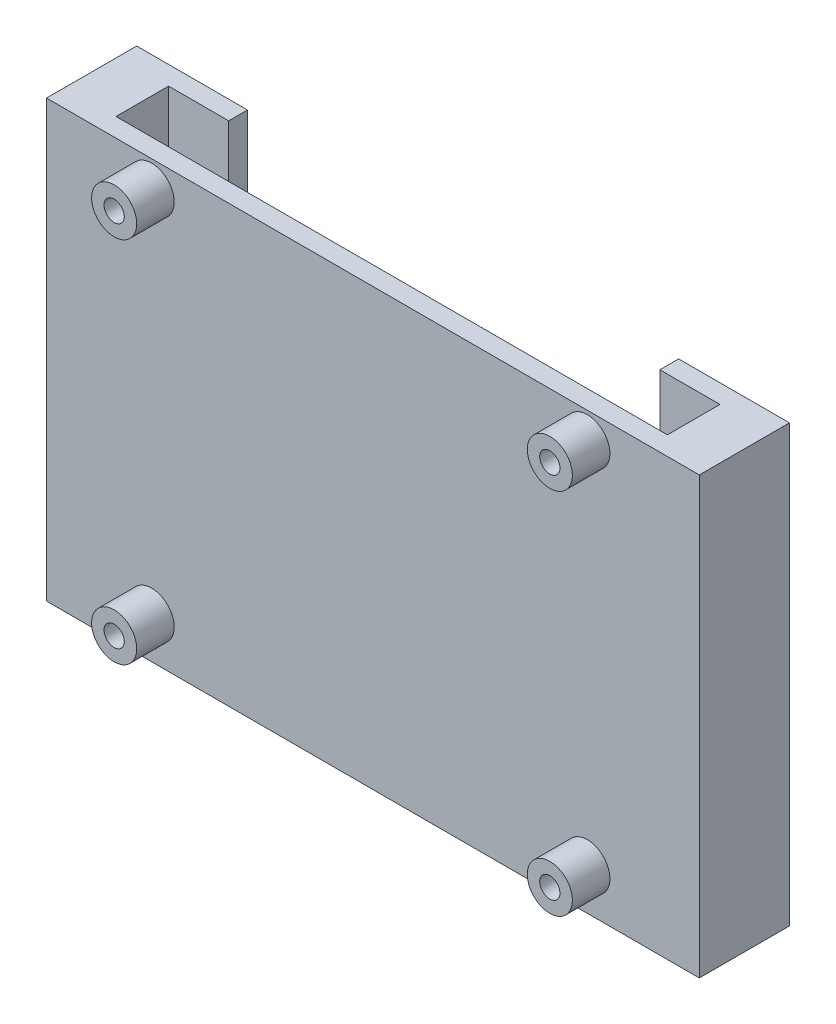
ISO-10303-21;
HEADER;
FILE_DESCRIPTION(('STEP AP214'),'2;1');
FILE_NAME('part.step','',(''),(''),'','','');
FILE_SCHEMA(('AUTOMOTIVE_DESIGN { 1 0 10303 214 1 1 1 1 }'));
ENDSEC;
DATA;
#1=APPLICATION_CONTEXT('core data for automotive mechanical design processes');
#2=APPLICATION_PROTOCOL_DEFINITION('international standard','automotive_design',2000,#1);
#3=PRODUCT_CONTEXT('',#1,'mechanical');
#4=PRODUCT('Part','Part','',(#3));
#5=PRODUCT_RELATED_PRODUCT_CATEGORY('part','',(#4));
#6=PRODUCT_DEFINITION_FORMATION('','',#4);
#7=PRODUCT_DEFINITION_CONTEXT('part definition',#1,'design');
#8=PRODUCT_DEFINITION('design','',#6,#7);
#9=PRODUCT_DEFINITION_SHAPE('','',#8);
#10=(LENGTH_UNIT() NAMED_UNIT(*) SI_UNIT(.MILLI.,.METRE.));
#11=(NAMED_UNIT(*) PLANE_ANGLE_UNIT() SI_UNIT($,.RADIAN.));
#12=(NAMED_UNIT(*) SI_UNIT($,.STERADIAN.) SOLID_ANGLE_UNIT());
#13=UNCERTAINTY_MEASURE_WITH_UNIT(LENGTH_MEASURE(1.E-05),#10,'distance_accuracy_value','');
#14=(GEOMETRIC_REPRESENTATION_CONTEXT(3) GLOBAL_UNCERTAINTY_ASSIGNED_CONTEXT((#13)) GLOBAL_UNIT_ASSIGNED_CONTEXT((#10,
#11,#12)) REPRESENTATION_CONTEXT('',''));
#15=CARTESIAN_POINT('',(0.,0.,0.));
#16=DIRECTION('',(0.,0.,1.));
#17=DIRECTION('',(1.,0.,0.));
#18=AXIS2_PLACEMENT_3D('',#15,#16,#17);
#19=CARTESIAN_POINT('',(-36.7,29.,-9.5));
#20=DIRECTION('',(-1.,0.,0.));
#21=DIRECTION('',(0.,0.,1.));
#22=AXIS2_PLACEMENT_3D('',#19,#20,#21);
#23=PLANE('',#22);
#24=DIRECTION('',(0.,-1.,0.));
#25=VECTOR('',#24,1.);
#26=CARTESIAN_POINT('',(-36.7,29.,-6.99999999999999));
#27=LINE('',#26,#25);
#28=CARTESIAN_POINT('',(-36.7,29.,-6.99999999999999));
#29=VERTEX_POINT('',#28);
#30=CARTESIAN_POINT('',(-36.7,-29.,-6.99999999999999));
#31=VERTEX_POINT('',#30);
#32=EDGE_CURVE('E157',#29,#31,#27,.T.);
#33=ORIENTED_EDGE('',*,*,#32,.F.);
#34=DIRECTION('',(0.,0.,1.));
#35=VECTOR('',#34,1.);
#36=CARTESIAN_POINT('',(-36.7,29.,-9.5));
#37=LINE('',#36,#35);
#38=CARTESIAN_POINT('',(-36.7,29.,0.));
#39=VERTEX_POINT('',#38);
#40=EDGE_CURVE('E186',#29,#39,#37,.T.);
#41=ORIENTED_EDGE('',*,*,#40,.T.);
#42=DIRECTION('',(0.,-1.,0.));
#43=VECTOR('',#42,1.);
#44=CARTESIAN_POINT('',(-36.7,29.,0.));
#45=LINE('',#44,#43);
#46=CARTESIAN_POINT('',(-36.7,-29.,0.));
#47=VERTEX_POINT('',#46);
#48=EDGE_CURVE('E191',#39,#47,#45,.T.);
#49=ORIENTED_EDGE('',*,*,#48,.T.);
#50=DIRECTION('',(0.,0.,1.));
#51=VECTOR('',#50,1.);
#52=CARTESIAN_POINT('',(-36.7,-29.,-9.5));
#53=LINE('',#52,#51);
#54=EDGE_CURVE('E57',#31,#47,#53,.T.);
#55=ORIENTED_EDGE('',*,*,#54,.F.);
#56=EDGE_LOOP('',(#33,#41,#49,#55));
#57=FACE_BOUND('',#56,.T.);
#58=ADVANCED_FACE('F41',(#57),#23,.F.);
#59=CARTESIAN_POINT('',(36.7,29.,-9.5));
#60=DIRECTION('',(1.,0.,0.));
#61=DIRECTION('',(0.,1.,0.));
#62=AXIS2_PLACEMENT_3D('',#59,#60,#61);
#63=PLANE('',#62);
#64=DIRECTION('',(0.,1.,0.));
#65=VECTOR('',#64,1.);
#66=CARTESIAN_POINT('',(36.7,29.,-7.));
#67=LINE('',#66,#65);
#68=CARTESIAN_POINT('',(36.7,-29.,-6.99999999999999));
#69=VERTEX_POINT('',#68);
#70=CARTESIAN_POINT('',(36.7,29.,-7.));
#71=VERTEX_POINT('',#70);
#72=EDGE_CURVE('E175',#69,#71,#67,.T.);
#73=ORIENTED_EDGE('',*,*,#72,.F.);
#74=DIRECTION('',(0.,0.,1.));
#75=VECTOR('',#74,1.);
#76=CARTESIAN_POINT('',(36.7,-29.,-9.5));
#77=LINE('',#76,#75);
#78=CARTESIAN_POINT('',(36.7,-29.,0.));
#79=VERTEX_POINT('',#78);
#80=EDGE_CURVE('E63',#69,#79,#77,.T.);
#81=ORIENTED_EDGE('',*,*,#80,.T.);
#82=DIRECTION('',(0.,1.,0.));
#83=VECTOR('',#82,1.);
#84=CARTESIAN_POINT('',(36.7,29.,0.));
#85=LINE('',#84,#83);
#86=CARTESIAN_POINT('',(36.7,29.,0.));
#87=VERTEX_POINT('',#86);
#88=EDGE_CURVE('E193',#79,#87,#85,.T.);
#89=ORIENTED_EDGE('',*,*,#88,.T.);
#90=DIRECTION('',(0.,0.,1.));
#91=VECTOR('',#90,1.);
#92=CARTESIAN_POINT('',(36.7,29.,-9.5));
#93=LINE('',#92,#91);
#94=EDGE_CURVE('E204',#71,#87,#93,.T.);
#95=ORIENTED_EDGE('',*,*,#94,.F.);
#96=EDGE_LOOP('',(#73,#81,#89,#95));
#97=FACE_BOUND('',#96,.T.);
#98=ADVANCED_FACE('F308',(#97),#63,.F.);
#99=CARTESIAN_POINT('',(0.,0.,0.));
#100=DIRECTION('',(0.,0.,-1.));
#101=DIRECTION('',(-1.,0.,0.));
#102=AXIS2_PLACEMENT_3D('',#99,#100,#101);
#103=PLANE('',#102);
#104=CARTESIAN_POINT('',(-29.45,25.5,0.));
#105=DIRECTION('',(0.,0.,1.));
#106=DIRECTION('',(1.,0.,0.));
#107=AXIS2_PLACEMENT_3D('',#104,#105,#106);
#108=CIRCLE('',#107,1.35);
#109=CARTESIAN_POINT('',(-28.1,25.5,0.));
#110=VERTEX_POINT('',#109);
#111=EDGE_CURVE('E211',#110,#110,#108,.T.);
#112=ORIENTED_EDGE('',*,*,#111,.T.);
#113=EDGE_LOOP('',(#112));
#114=FACE_BOUND('',#113,.T.);
#115=CARTESIAN_POINT('',(-29.45,-23.5,0.));
#116=DIRECTION('',(0.,0.,1.));
#117=DIRECTION('',(1.,0.,0.));
#118=AXIS2_PLACEMENT_3D('',#115,#116,#117);
#119=CIRCLE('',#118,1.35);
#120=CARTESIAN_POINT('',(-28.1,-23.5,0.));
#121=VERTEX_POINT('',#120);
#122=EDGE_CURVE('E220',#121,#121,#119,.T.);
#123=ORIENTED_EDGE('',*,*,#122,.T.);
#124=EDGE_LOOP('',(#123));
#125=FACE_BOUND('',#124,.T.);
#126=CARTESIAN_POINT('',(28.55,25.5,0.));
#127=DIRECTION('',(0.,0.,1.));
#128=DIRECTION('',(1.,0.,0.));
#129=AXIS2_PLACEMENT_3D('',#126,#127,#128);
#130=CIRCLE('',#129,1.35);
#131=CARTESIAN_POINT('',(29.9,25.5,0.));
#132=VERTEX_POINT('',#131);
#133=EDGE_CURVE('E222',#132,#132,#130,.T.);
#134=ORIENTED_EDGE('',*,*,#133,.T.);
#135=EDGE_LOOP('',(#134));
#136=FACE_BOUND('',#135,.T.);
#137=CARTESIAN_POINT('',(28.55,-23.5,0.));
#138=DIRECTION('',(0.,0.,1.));
#139=DIRECTION('',(1.,0.,0.));
#140=AXIS2_PLACEMENT_3D('',#137,#138,#139);
#141=CIRCLE('',#140,1.35);
#142=CARTESIAN_POINT('',(29.9,-23.5,0.));
#143=VERTEX_POINT('',#142);
#144=EDGE_CURVE('E229',#143,#143,#141,.T.);
#145=ORIENTED_EDGE('',*,*,#144,.T.);
#146=EDGE_LOOP('',(#145));
#147=FACE_BOUND('',#146,.T.);
#148=DIRECTION('',(1.,0.,0.));
#149=VECTOR('',#148,1.);
#150=CARTESIAN_POINT('',(-43.45,-29.,0.));
#151=LINE('',#150,#149);
#152=EDGE_CURVE('E249',#47,#79,#151,.T.);
#153=ORIENTED_EDGE('',*,*,#152,.F.);
#154=ORIENTED_EDGE('',*,*,#48,.F.);
#155=DIRECTION('',(-1.,0.,0.));
#156=VECTOR('',#155,1.);
#157=CARTESIAN_POINT('',(-43.45,29.,0.));
#158=LINE('',#157,#156);
#159=EDGE_CURVE('E244',#87,#39,#158,.T.);
#160=ORIENTED_EDGE('',*,*,#159,.F.);
#161=ORIENTED_EDGE('',*,*,#88,.F.);
#162=EDGE_LOOP('',(#153,#154,#160,#161));
#163=FACE_BOUND('',#162,.T.);
#164=ADVANCED_FACE('F315',(#114,#125,#136,#147,#163),#103,.T.);
#165=CARTESIAN_POINT('',(43.45,-29.,2.5));
#166=DIRECTION('',(-1.,0.,0.));
#167=DIRECTION('',(0.,0.,1.));
#168=AXIS2_PLACEMENT_3D('',#165,#166,#167);
#169=PLANE('',#168);
#170=DIRECTION('',(0.,0.,-1.));
#171=VECTOR('',#170,1.);
#172=CARTESIAN_POINT('',(43.45,-29.,2.5));
#173=LINE('',#172,#171);
#174=CARTESIAN_POINT('',(43.45,-29.,2.5));
#175=VERTEX_POINT('',#174);
#176=CARTESIAN_POINT('',(43.45,-29.,-9.5));
#177=VERTEX_POINT('',#176);
#178=EDGE_CURVE('E259',#175,#177,#173,.T.);
#179=ORIENTED_EDGE('',*,*,#178,.T.);
#180=DIRECTION('',(0.,-1.,0.));
#181=VECTOR('',#180,1.);
#182=CARTESIAN_POINT('',(43.45,29.,-9.5));
#183=LINE('',#182,#181);
#184=CARTESIAN_POINT('',(43.45,29.,-9.5));
#185=VERTEX_POINT('',#184);
#186=EDGE_CURVE('E199',#185,#177,#183,.T.);
#187=ORIENTED_EDGE('',*,*,#186,.F.);
#188=DIRECTION('',(0.,0.,-1.));
#189=VECTOR('',#188,1.);
#190=CARTESIAN_POINT('',(43.45,29.,2.5));
#191=LINE('',#190,#189);
#192=CARTESIAN_POINT('',(43.45,29.,2.5));
#193=VERTEX_POINT('',#192);
#194=EDGE_CURVE('E263',#193,#185,#191,.T.);
#195=ORIENTED_EDGE('',*,*,#194,.F.);
#196=DIRECTION('',(0.,1.,0.));
#197=VECTOR('',#196,1.);
#198=CARTESIAN_POINT('',(43.45,-29.,2.5));
#199=LINE('',#198,#197);
#200=EDGE_CURVE('E246',#175,#193,#199,.T.);
#201=ORIENTED_EDGE('',*,*,#200,.F.);
#202=EDGE_LOOP('',(#179,#187,#195,#201));
#203=FACE_BOUND('',#202,.T.);
#204=ADVANCED_FACE('F43',(#203),#169,.F.);
#205=CARTESIAN_POINT('',(-43.45,29.,2.5));
#206=DIRECTION('',(0.,-1.,0.));
#207=DIRECTION('',(0.,0.,-1.));
#208=AXIS2_PLACEMENT_3D('',#205,#206,#207);
#209=PLANE('',#208);
#210=ORIENTED_EDGE('',*,*,#194,.T.);
#211=DIRECTION('',(1.,0.,0.));
#212=VECTOR('',#211,1.);
#213=CARTESIAN_POINT('',(43.45,29.,-9.5));
#214=LINE('',#213,#212);
#215=CARTESIAN_POINT('',(28.7,29.,-9.5));
#216=VERTEX_POINT('',#215);
#217=EDGE_CURVE('E205',#216,#185,#214,.T.);
#218=ORIENTED_EDGE('',*,*,#217,.F.);
#219=DIRECTION('',(0.,0.,-1.));
#220=VECTOR('',#219,1.);
#221=CARTESIAN_POINT('',(28.7,29.,-9.5));
#222=LINE('',#221,#220);
#223=CARTESIAN_POINT('',(28.7,29.,-7.));
#224=VERTEX_POINT('',#223);
#225=EDGE_CURVE('E179',#224,#216,#222,.T.);
#226=ORIENTED_EDGE('',*,*,#225,.F.);
#227=DIRECTION('',(1.,0.,0.));
#228=VECTOR('',#227,1.);
#229=CARTESIAN_POINT('',(28.7,29.,-7.));
#230=LINE('',#229,#228);
#231=EDGE_CURVE('E182',#224,#71,#230,.T.);
#232=ORIENTED_EDGE('',*,*,#231,.T.);
#233=ORIENTED_EDGE('',*,*,#94,.T.);
#234=ORIENTED_EDGE('',*,*,#159,.T.);
#235=ORIENTED_EDGE('',*,*,#40,.F.);
#236=DIRECTION('',(-1.,0.,0.));
#237=VECTOR('',#236,1.);
#238=CARTESIAN_POINT('',(-28.7,29.,-6.99999999999999));
#239=LINE('',#238,#237);
#240=CARTESIAN_POINT('',(-28.7,29.,-6.99999999999999));
#241=VERTEX_POINT('',#240);
#242=EDGE_CURVE('E147',#241,#29,#239,.T.);
#243=ORIENTED_EDGE('',*,*,#242,.F.);
#244=DIRECTION('',(0.,0.,1.));
#245=VECTOR('',#244,1.);
#246=CARTESIAN_POINT('',(-28.7,29.,-9.5));
#247=LINE('',#246,#245);
#248=CARTESIAN_POINT('',(-28.7,29.,-9.5));
#249=VERTEX_POINT('',#248);
#250=EDGE_CURVE('E146',#249,#241,#247,.T.);
#251=ORIENTED_EDGE('',*,*,#250,.F.);
#252=DIRECTION('',(1.,0.,0.));
#253=VECTOR('',#252,1.);
#254=CARTESIAN_POINT('',(-43.45,29.,-9.5));
#255=LINE('',#254,#253);
#256=CARTESIAN_POINT('',(-43.45,29.,-9.5));
#257=VERTEX_POINT('',#256);
#258=EDGE_CURVE('E131',#257,#249,#255,.T.);
#259=ORIENTED_EDGE('',*,*,#258,.F.);
#260=DIRECTION('',(0.,0.,-1.));
#261=VECTOR('',#260,1.);
#262=CARTESIAN_POINT('',(-43.45,29.,2.5));
#263=LINE('',#262,#261);
#264=CARTESIAN_POINT('',(-43.45,29.,2.5));
#265=VERTEX_POINT('',#264);
#266=EDGE_CURVE('E265',#265,#257,#263,.T.);
#267=ORIENTED_EDGE('',*,*,#266,.F.);
#268=DIRECTION('',(-1.,0.,0.));
#269=VECTOR('',#268,1.);
#270=CARTESIAN_POINT('',(-43.45,29.,2.5));
#271=LINE('',#270,#269);
#272=EDGE_CURVE('E248',#193,#265,#271,.T.);
#273=ORIENTED_EDGE('',*,*,#272,.F.);
#274=EDGE_LOOP('',(#210,#218,#226,#232,#233,#234,#235,#243,#251,#259,#267,#273));
#275=FACE_BOUND('',#274,.T.);
#276=ADVANCED_FACE('F150',(#275),#209,.F.);
#277=CARTESIAN_POINT('',(-43.45,-29.,2.5));
#278=DIRECTION('',(1.,0.,0.));
#279=DIRECTION('',(0.,0.,-1.));
#280=AXIS2_PLACEMENT_3D('',#277,#278,#279);
#281=PLANE('',#280);
#282=ORIENTED_EDGE('',*,*,#266,.T.);
#283=DIRECTION('',(0.,1.,0.));
#284=VECTOR('',#283,1.);
#285=CARTESIAN_POINT('',(-43.45,29.,-9.5));
#286=LINE('',#285,#284);
#287=CARTESIAN_POINT('',(-43.45,-29.,-9.5));
#288=VERTEX_POINT('',#287);
#289=EDGE_CURVE('E142',#288,#257,#286,.T.);
#290=ORIENTED_EDGE('',*,*,#289,.F.);
#291=DIRECTION('',(0.,0.,-1.));
#292=VECTOR('',#291,1.);
#293=CARTESIAN_POINT('',(-43.45,-29.,2.5));
#294=LINE('',#293,#292);
#295=CARTESIAN_POINT('',(-43.45,-29.,2.5));
#296=VERTEX_POINT('',#295);
#297=EDGE_CURVE('E262',#296,#288,#294,.T.);
#298=ORIENTED_EDGE('',*,*,#297,.F.);
#299=DIRECTION('',(0.,-1.,0.));
#300=VECTOR('',#299,1.);
#301=CARTESIAN_POINT('',(-43.45,-29.,2.5));
#302=LINE('',#301,#300);
#303=EDGE_CURVE('E255',#265,#296,#302,.T.);
#304=ORIENTED_EDGE('',*,*,#303,.F.);
#305=EDGE_LOOP('',(#282,#290,#298,#304));
#306=FACE_BOUND('',#305,.T.);
#307=ADVANCED_FACE('F324',(#306),#281,.F.);
#308=CARTESIAN_POINT('',(-43.45,-29.,2.5));
#309=DIRECTION('',(0.,1.,0.));
#310=DIRECTION('',(0.,0.,1.));
#311=AXIS2_PLACEMENT_3D('',#308,#309,#310);
#312=PLANE('',#311);
#313=CARTESIAN_POINT('',(-40.075,-29.,-3.5));
#314=DIRECTION('',(0.,-1.,0.));
#315=DIRECTION('',(0.,0.,-1.));
#316=AXIS2_PLACEMENT_3D('',#313,#314,#315);
#317=CIRCLE('',#316,3.15);
#318=CARTESIAN_POINT('',(-40.075,-29.,-6.65));
#319=VERTEX_POINT('',#318);
#320=EDGE_CURVE('E518',#319,#319,#317,.T.);
#321=ORIENTED_EDGE('',*,*,#320,.F.);
#322=EDGE_LOOP('',(#321));
#323=FACE_BOUND('',#322,.T.);
#324=CARTESIAN_POINT('',(40.075,-29.,-3.5));
#325=DIRECTION('',(0.,-1.,0.));
#326=DIRECTION('',(0.,0.,-1.));
#327=AXIS2_PLACEMENT_3D('',#324,#325,#326);
#328=CIRCLE('',#327,3.15);
#329=CARTESIAN_POINT('',(40.075,-29.,-6.65));
#330=VERTEX_POINT('',#329);
#331=EDGE_CURVE('E524',#330,#330,#328,.T.);
#332=ORIENTED_EDGE('',*,*,#331,.F.);
#333=EDGE_LOOP('',(#332));
#334=FACE_BOUND('',#333,.T.);
#335=ORIENTED_EDGE('',*,*,#297,.T.);
#336=DIRECTION('',(-1.,0.,0.));
#337=VECTOR('',#336,1.);
#338=CARTESIAN_POINT('',(-43.45,-29.,-9.5));
#339=LINE('',#338,#337);
#340=CARTESIAN_POINT('',(-28.7,-29.,-9.50000000000001));
#341=VERTEX_POINT('',#340);
#342=EDGE_CURVE('E144',#341,#288,#339,.T.);
#343=ORIENTED_EDGE('',*,*,#342,.F.);
#344=DIRECTION('',(0.,0.,-1.));
#345=VECTOR('',#344,1.);
#346=CARTESIAN_POINT('',(-28.7,-29.,-9.50000000000001));
#347=LINE('',#346,#345);
#348=CARTESIAN_POINT('',(-28.7,-29.,-6.99999999999999));
#349=VERTEX_POINT('',#348);
#350=EDGE_CURVE('E156',#349,#341,#347,.T.);
#351=ORIENTED_EDGE('',*,*,#350,.F.);
#352=DIRECTION('',(-1.,0.,0.));
#353=VECTOR('',#352,1.);
#354=CARTESIAN_POINT('',(-28.7,-29.,-6.99999999999999));
#355=LINE('',#354,#353);
#356=EDGE_CURVE('E166',#349,#31,#355,.T.);
#357=ORIENTED_EDGE('',*,*,#356,.T.);
#358=ORIENTED_EDGE('',*,*,#54,.T.);
#359=ORIENTED_EDGE('',*,*,#152,.T.);
#360=ORIENTED_EDGE('',*,*,#80,.F.);
#361=DIRECTION('',(1.,0.,0.));
#362=VECTOR('',#361,1.);
#363=CARTESIAN_POINT('',(28.7,-29.,-6.99999999999999));
#364=LINE('',#363,#362);
#365=CARTESIAN_POINT('',(28.7,-29.,-6.99999999999999));
#366=VERTEX_POINT('',#365);
#367=EDGE_CURVE('E190',#366,#69,#364,.T.);
#368=ORIENTED_EDGE('',*,*,#367,.F.);
#369=DIRECTION('',(0.,0.,1.));
#370=VECTOR('',#369,1.);
#371=CARTESIAN_POINT('',(28.7,-29.,-9.49999999999999));
#372=LINE('',#371,#370);
#373=CARTESIAN_POINT('',(28.7,-29.,-9.49999999999999));
#374=VERTEX_POINT('',#373);
#375=EDGE_CURVE('E176',#374,#366,#372,.T.);
#376=ORIENTED_EDGE('',*,*,#375,.F.);
#377=DIRECTION('',(-1.,0.,0.));
#378=VECTOR('',#377,1.);
#379=CARTESIAN_POINT('',(43.45,-29.,-9.5));
#380=LINE('',#379,#378);
#381=EDGE_CURVE('E198',#177,#374,#380,.T.);
#382=ORIENTED_EDGE('',*,*,#381,.F.);
#383=ORIENTED_EDGE('',*,*,#178,.F.);
#384=DIRECTION('',(1.,0.,0.));
#385=VECTOR('',#384,1.);
#386=CARTESIAN_POINT('',(-43.45,-29.,2.5));
#387=LINE('',#386,#385);
#388=EDGE_CURVE('E251',#296,#175,#387,.T.);
#389=ORIENTED_EDGE('',*,*,#388,.F.);
#390=EDGE_LOOP('',(#335,#343,#351,#357,#358,#359,#360,#368,#376,#382,#383,#389));
#391=FACE_BOUND('',#390,.T.);
#392=ADVANCED_FACE('F282',(#323,#334,#391),#312,.F.);
#393=CARTESIAN_POINT('',(0.,0.,2.5));
#394=DIRECTION('',(0.,0.,-1.));
#395=DIRECTION('',(-1.,0.,0.));
#396=AXIS2_PLACEMENT_3D('',#393,#394,#395);
#397=PLANE('',#396);
#398=CARTESIAN_POINT('',(28.55,-23.5,2.5));
#399=DIRECTION('',(0.,0.,-1.));
#400=DIRECTION('',(-1.,0.,0.));
#401=AXIS2_PLACEMENT_3D('',#398,#399,#400);
#402=CIRCLE('',#401,3.);
#403=CARTESIAN_POINT('',(25.55,-23.5,2.5));
#404=VERTEX_POINT('',#403);
#405=EDGE_CURVE('E11',#404,#404,#402,.F.);
#406=ORIENTED_EDGE('',*,*,#405,.F.);
#407=EDGE_LOOP('',(#406));
#408=FACE_BOUND('',#407,.T.);
#409=CARTESIAN_POINT('',(-29.45,-23.5,2.5));
#410=DIRECTION('',(0.,0.,-1.));
#411=DIRECTION('',(-1.,0.,0.));
#412=AXIS2_PLACEMENT_3D('',#409,#410,#411);
#413=CIRCLE('',#412,3.);
#414=CARTESIAN_POINT('',(-32.45,-23.5,2.5));
#415=VERTEX_POINT('',#414);
#416=EDGE_CURVE('E47',#415,#415,#413,.F.);
#417=ORIENTED_EDGE('',*,*,#416,.F.);
#418=EDGE_LOOP('',(#417));
#419=FACE_BOUND('',#418,.T.);
#420=CARTESIAN_POINT('',(28.55,25.5,2.5));
#421=DIRECTION('',(0.,0.,-1.));
#422=DIRECTION('',(-1.,0.,0.));
#423=AXIS2_PLACEMENT_3D('',#420,#421,#422);
#424=CIRCLE('',#423,3.);
#425=CARTESIAN_POINT('',(25.55,25.5,2.5));
#426=VERTEX_POINT('',#425);
#427=EDGE_CURVE('E269',#426,#426,#424,.F.);
#428=ORIENTED_EDGE('',*,*,#427,.F.);
#429=EDGE_LOOP('',(#428));
#430=FACE_BOUND('',#429,.T.);
#431=CARTESIAN_POINT('',(-29.45,25.5,2.5));
#432=DIRECTION('',(0.,0.,-1.));
#433=DIRECTION('',(-1.,0.,0.));
#434=AXIS2_PLACEMENT_3D('',#431,#432,#433);
#435=CIRCLE('',#434,3.);
#436=CARTESIAN_POINT('',(-32.45,25.5,2.5));
#437=VERTEX_POINT('',#436);
#438=EDGE_CURVE('E270',#437,#437,#435,.F.);
#439=ORIENTED_EDGE('',*,*,#438,.F.);
#440=EDGE_LOOP('',(#439));
#441=FACE_BOUND('',#440,.T.);
#442=ORIENTED_EDGE('',*,*,#200,.T.);
#443=ORIENTED_EDGE('',*,*,#272,.T.);
#444=ORIENTED_EDGE('',*,*,#303,.T.);
#445=ORIENTED_EDGE('',*,*,#388,.T.);
#446=EDGE_LOOP('',(#442,#443,#444,#445));
#447=FACE_BOUND('',#446,.T.);
#448=ADVANCED_FACE('F276',(#408,#419,#430,#441,#447),#397,.F.);
#449=CARTESIAN_POINT('',(-29.45,25.5,7.5));
#450=DIRECTION('',(0.,0.,-1.));
#451=DIRECTION('',(-1.,0.,0.));
#452=AXIS2_PLACEMENT_3D('',#449,#450,#451);
#453=CYLINDRICAL_SURFACE('',#452,3.);
#454=CARTESIAN_POINT('',(-29.45,25.5,7.5));
#455=DIRECTION('',(0.,0.,1.));
#456=DIRECTION('',(1.,0.,0.));
#457=AXIS2_PLACEMENT_3D('',#454,#455,#456);
#458=CIRCLE('',#457,3.);
#459=CARTESIAN_POINT('',(-26.45,25.5,7.5));
#460=VERTEX_POINT('',#459);
#461=EDGE_CURVE('E245',#460,#460,#458,.T.);
#462=ORIENTED_EDGE('',*,*,#461,.F.);
#463=EDGE_LOOP('',(#462));
#464=FACE_BOUND('',#463,.T.);
#465=ORIENTED_EDGE('',*,*,#438,.T.);
#466=EDGE_LOOP('',(#465));
#467=FACE_BOUND('',#466,.T.);
#468=ADVANCED_FACE('F277',(#464,#467),#453,.T.);
#469=CARTESIAN_POINT('',(-29.45,25.5,7.5));
#470=DIRECTION('',(0.,0.,1.));
#471=DIRECTION('',(1.,0.,0.));
#472=AXIS2_PLACEMENT_3D('',#469,#470,#471);
#473=PLANE('',#472);
#474=CARTESIAN_POINT('',(-29.45,25.5,7.5));
#475=DIRECTION('',(0.,0.,1.));
#476=DIRECTION('',(1.,0.,0.));
#477=AXIS2_PLACEMENT_3D('',#474,#475,#476);
#478=CIRCLE('',#477,1.34999999999999);
#479=CARTESIAN_POINT('',(-28.1,25.5,7.5));
#480=VERTEX_POINT('',#479);
#481=EDGE_CURVE('E209',#480,#480,#478,.T.);
#482=ORIENTED_EDGE('',*,*,#481,.F.);
#483=EDGE_LOOP('',(#482));
#484=FACE_BOUND('',#483,.T.);
#485=ORIENTED_EDGE('',*,*,#461,.T.);
#486=EDGE_LOOP('',(#485));
#487=FACE_BOUND('',#486,.T.);
#488=ADVANCED_FACE('F380',(#484,#487),#473,.T.);
#489=CARTESIAN_POINT('',(28.55,25.5,7.5));
#490=DIRECTION('',(0.,0.,-1.));
#491=DIRECTION('',(-1.,0.,0.));
#492=AXIS2_PLACEMENT_3D('',#489,#490,#491);
#493=CYLINDRICAL_SURFACE('',#492,3.);
#494=CARTESIAN_POINT('',(28.55,25.5,7.5));
#495=DIRECTION('',(0.,0.,1.));
#496=DIRECTION('',(1.,0.,0.));
#497=AXIS2_PLACEMENT_3D('',#494,#495,#496);
#498=CIRCLE('',#497,3.);
#499=CARTESIAN_POINT('',(31.55,25.5,7.5));
#500=VERTEX_POINT('',#499);
#501=EDGE_CURVE('E237',#500,#500,#498,.T.);
#502=ORIENTED_EDGE('',*,*,#501,.F.);
#503=EDGE_LOOP('',(#502));
#504=FACE_BOUND('',#503,.T.);
#505=ORIENTED_EDGE('',*,*,#427,.T.);
#506=EDGE_LOOP('',(#505));
#507=FACE_BOUND('',#506,.T.);
#508=ADVANCED_FACE('F372',(#504,#507),#493,.T.);
#509=CARTESIAN_POINT('',(28.55,25.5,7.5));
#510=DIRECTION('',(0.,0.,1.));
#511=DIRECTION('',(1.,0.,0.));
#512=AXIS2_PLACEMENT_3D('',#509,#510,#511);
#513=PLANE('',#512);
#514=CARTESIAN_POINT('',(28.55,25.5,7.5));
#515=DIRECTION('',(0.,0.,1.));
#516=DIRECTION('',(1.,0.,0.));
#517=AXIS2_PLACEMENT_3D('',#514,#515,#516);
#518=CIRCLE('',#517,1.34999999999999);
#519=CARTESIAN_POINT('',(29.9,25.5,7.5));
#520=VERTEX_POINT('',#519);
#521=EDGE_CURVE('E223',#520,#520,#518,.T.);
#522=ORIENTED_EDGE('',*,*,#521,.F.);
#523=EDGE_LOOP('',(#522));
#524=FACE_BOUND('',#523,.T.);
#525=ORIENTED_EDGE('',*,*,#501,.T.);
#526=EDGE_LOOP('',(#525));
#527=FACE_BOUND('',#526,.T.);
#528=ADVANCED_FACE('F375',(#524,#527),#513,.T.);
#529=CARTESIAN_POINT('',(-29.45,-23.5,7.5));
#530=DIRECTION('',(0.,0.,-1.));
#531=DIRECTION('',(-1.,0.,0.));
#532=AXIS2_PLACEMENT_3D('',#529,#530,#531);
#533=CYLINDRICAL_SURFACE('',#532,3.);
#534=CARTESIAN_POINT('',(-29.45,-23.5,7.5));
#535=DIRECTION('',(0.,0.,1.));
#536=DIRECTION('',(1.,0.,0.));
#537=AXIS2_PLACEMENT_3D('',#534,#535,#536);
#538=CIRCLE('',#537,3.);
#539=CARTESIAN_POINT('',(-26.45,-23.5,7.5));
#540=VERTEX_POINT('',#539);
#541=EDGE_CURVE('E236',#540,#540,#538,.T.);
#542=ORIENTED_EDGE('',*,*,#541,.F.);
#543=EDGE_LOOP('',(#542));
#544=FACE_BOUND('',#543,.T.);
#545=ORIENTED_EDGE('',*,*,#416,.T.);
#546=EDGE_LOOP('',(#545));
#547=FACE_BOUND('',#546,.T.);
#548=ADVANCED_FACE('F273',(#544,#547),#533,.T.);
#549=CARTESIAN_POINT('',(-29.45,-23.5,7.5));
#550=DIRECTION('',(0.,0.,1.));
#551=DIRECTION('',(1.,0.,0.));
#552=AXIS2_PLACEMENT_3D('',#549,#550,#551);
#553=PLANE('',#552);
#554=CARTESIAN_POINT('',(-29.45,-23.5,7.5));
#555=DIRECTION('',(0.,0.,1.));
#556=DIRECTION('',(1.,0.,0.));
#557=AXIS2_PLACEMENT_3D('',#554,#555,#556);
#558=CIRCLE('',#557,1.34999999999999);
#559=CARTESIAN_POINT('',(-28.1,-23.5,7.5));
#560=VERTEX_POINT('',#559);
#561=EDGE_CURVE('E212',#560,#560,#558,.T.);
#562=ORIENTED_EDGE('',*,*,#561,.F.);
#563=EDGE_LOOP('',(#562));
#564=FACE_BOUND('',#563,.T.);
#565=ORIENTED_EDGE('',*,*,#541,.T.);
#566=EDGE_LOOP('',(#565));
#567=FACE_BOUND('',#566,.T.);
#568=ADVANCED_FACE('F362',(#564,#567),#553,.T.);
#569=CARTESIAN_POINT('',(28.55,-23.5,7.5));
#570=DIRECTION('',(0.,0.,-1.));
#571=DIRECTION('',(-1.,0.,0.));
#572=AXIS2_PLACEMENT_3D('',#569,#570,#571);
#573=CYLINDRICAL_SURFACE('',#572,3.);
#574=CARTESIAN_POINT('',(28.55,-23.5,7.5));
#575=DIRECTION('',(0.,0.,1.));
#576=DIRECTION('',(1.,0.,0.));
#577=AXIS2_PLACEMENT_3D('',#574,#575,#576);
#578=CIRCLE('',#577,3.);
#579=CARTESIAN_POINT('',(31.55,-23.5,7.5));
#580=VERTEX_POINT('',#579);
#581=EDGE_CURVE('E231',#580,#580,#578,.T.);
#582=ORIENTED_EDGE('',*,*,#581,.F.);
#583=EDGE_LOOP('',(#582));
#584=FACE_BOUND('',#583,.T.);
#585=ORIENTED_EDGE('',*,*,#405,.T.);
#586=EDGE_LOOP('',(#585));
#587=FACE_BOUND('',#586,.T.);
#588=ADVANCED_FACE('F363',(#584,#587),#573,.T.);
#589=CARTESIAN_POINT('',(28.55,-23.5,7.5));
#590=DIRECTION('',(0.,0.,1.));
#591=DIRECTION('',(1.,0.,0.));
#592=AXIS2_PLACEMENT_3D('',#589,#590,#591);
#593=PLANE('',#592);
#594=CARTESIAN_POINT('',(28.55,-23.5,7.5));
#595=DIRECTION('',(0.,0.,1.));
#596=DIRECTION('',(1.,0.,0.));
#597=AXIS2_PLACEMENT_3D('',#594,#595,#596);
#598=CIRCLE('',#597,1.34999999999999);
#599=CARTESIAN_POINT('',(29.9,-23.5,7.5));
#600=VERTEX_POINT('',#599);
#601=EDGE_CURVE('E227',#600,#600,#598,.T.);
#602=ORIENTED_EDGE('',*,*,#601,.F.);
#603=EDGE_LOOP('',(#602));
#604=FACE_BOUND('',#603,.T.);
#605=ORIENTED_EDGE('',*,*,#581,.T.);
#606=EDGE_LOOP('',(#605));
#607=FACE_BOUND('',#606,.T.);
#608=ADVANCED_FACE('F357',(#604,#607),#593,.T.);
#609=CARTESIAN_POINT('',(28.55,-23.5,7.5));
#610=DIRECTION('',(0.,0.,1.));
#611=DIRECTION('',(1.,0.,0.));
#612=AXIS2_PLACEMENT_3D('',#609,#610,#611);
#613=CYLINDRICAL_SURFACE('',#612,1.35);
#614=ORIENTED_EDGE('',*,*,#144,.F.);
#615=EDGE_LOOP('',(#614));
#616=FACE_BOUND('',#615,.T.);
#617=ORIENTED_EDGE('',*,*,#601,.T.);
#618=EDGE_LOOP('',(#617));
#619=FACE_BOUND('',#618,.T.);
#620=ADVANCED_FACE('F351',(#616,#619),#613,.F.);
#621=CARTESIAN_POINT('',(28.55,25.5,7.5));
#622=DIRECTION('',(0.,0.,1.));
#623=DIRECTION('',(1.,0.,0.));
#624=AXIS2_PLACEMENT_3D('',#621,#622,#623);
#625=CYLINDRICAL_SURFACE('',#624,1.35);
#626=ORIENTED_EDGE('',*,*,#133,.F.);
#627=EDGE_LOOP('',(#626));
#628=FACE_BOUND('',#627,.T.);
#629=ORIENTED_EDGE('',*,*,#521,.T.);
#630=EDGE_LOOP('',(#629));
#631=FACE_BOUND('',#630,.T.);
#632=ADVANCED_FACE('F346',(#628,#631),#625,.F.);
#633=CARTESIAN_POINT('',(-29.45,-23.5,7.5));
#634=DIRECTION('',(0.,0.,1.));
#635=DIRECTION('',(1.,0.,0.));
#636=AXIS2_PLACEMENT_3D('',#633,#634,#635);
#637=CYLINDRICAL_SURFACE('',#636,1.35);
#638=ORIENTED_EDGE('',*,*,#122,.F.);
#639=EDGE_LOOP('',(#638));
#640=FACE_BOUND('',#639,.T.);
#641=ORIENTED_EDGE('',*,*,#561,.T.);
#642=EDGE_LOOP('',(#641));
#643=FACE_BOUND('',#642,.T.);
#644=ADVANCED_FACE('F342',(#640,#643),#637,.F.);
#645=CARTESIAN_POINT('',(-29.45,25.5,7.5));
#646=DIRECTION('',(0.,0.,1.));
#647=DIRECTION('',(1.,0.,0.));
#648=AXIS2_PLACEMENT_3D('',#645,#646,#647);
#649=CYLINDRICAL_SURFACE('',#648,1.35);
#650=ORIENTED_EDGE('',*,*,#111,.F.);
#651=EDGE_LOOP('',(#650));
#652=FACE_BOUND('',#651,.T.);
#653=ORIENTED_EDGE('',*,*,#481,.T.);
#654=EDGE_LOOP('',(#653));
#655=FACE_BOUND('',#654,.T.);
#656=ADVANCED_FACE('F344',(#652,#655),#649,.F.);
#657=CARTESIAN_POINT('',(0.,0.,-9.5));
#658=DIRECTION('',(0.,0.,-1.));
#659=DIRECTION('',(-1.,0.,0.));
#660=AXIS2_PLACEMENT_3D('',#657,#658,#659);
#661=PLANE('',#660);
#662=ORIENTED_EDGE('',*,*,#186,.T.);
#663=ORIENTED_EDGE('',*,*,#381,.T.);
#664=DIRECTION('',(0.,-1.,0.));
#665=VECTOR('',#664,1.);
#666=CARTESIAN_POINT('',(28.7,29.,-9.5));
#667=LINE('',#666,#665);
#668=EDGE_CURVE('E173',#216,#374,#667,.T.);
#669=ORIENTED_EDGE('',*,*,#668,.F.);
#670=ORIENTED_EDGE('',*,*,#217,.T.);
#671=EDGE_LOOP('',(#662,#663,#669,#670));
#672=FACE_BOUND('',#671,.T.);
#673=ADVANCED_FACE('F300',(#672),#661,.T.);
#674=CARTESIAN_POINT('',(0.,0.,-9.5));
#675=DIRECTION('',(0.,0.,1.));
#676=DIRECTION('',(1.,0.,0.));
#677=AXIS2_PLACEMENT_3D('',#674,#675,#676);
#678=PLANE('',#677);
#679=ORIENTED_EDGE('',*,*,#289,.T.);
#680=ORIENTED_EDGE('',*,*,#258,.T.);
#681=DIRECTION('',(0.,1.,0.));
#682=VECTOR('',#681,1.);
#683=CARTESIAN_POINT('',(-28.7,29.,-9.5));
#684=LINE('',#683,#682);
#685=EDGE_CURVE('E137',#341,#249,#684,.T.);
#686=ORIENTED_EDGE('',*,*,#685,.F.);
#687=ORIENTED_EDGE('',*,*,#342,.T.);
#688=EDGE_LOOP('',(#679,#680,#686,#687));
#689=FACE_BOUND('',#688,.T.);
#690=ADVANCED_FACE('F138',(#689),#678,.F.);
#691=CARTESIAN_POINT('',(28.7,29.,-7.));
#692=DIRECTION('',(0.,0.,-1.));
#693=DIRECTION('',(0.,1.,0.));
#694=AXIS2_PLACEMENT_3D('',#691,#692,#693);
#695=PLANE('',#694);
#696=ORIENTED_EDGE('',*,*,#72,.T.);
#697=ORIENTED_EDGE('',*,*,#231,.F.);
#698=DIRECTION('',(0.,1.,0.));
#699=VECTOR('',#698,1.);
#700=CARTESIAN_POINT('',(28.7,29.,-7.));
#701=LINE('',#700,#699);
#702=EDGE_CURVE('E178',#366,#224,#701,.T.);
#703=ORIENTED_EDGE('',*,*,#702,.F.);
#704=ORIENTED_EDGE('',*,*,#367,.T.);
#705=EDGE_LOOP('',(#696,#697,#703,#704));
#706=FACE_BOUND('',#705,.T.);
#707=ADVANCED_FACE('F325',(#706),#695,.F.);
#708=CARTESIAN_POINT('',(28.7,0.,0.));
#709=DIRECTION('',(-1.,0.,0.));
#710=DIRECTION('',(0.,-1.,0.));
#711=AXIS2_PLACEMENT_3D('',#708,#709,#710);
#712=PLANE('',#711);
#713=ORIENTED_EDGE('',*,*,#668,.T.);
#714=ORIENTED_EDGE('',*,*,#375,.T.);
#715=ORIENTED_EDGE('',*,*,#702,.T.);
#716=ORIENTED_EDGE('',*,*,#225,.T.);
#717=EDGE_LOOP('',(#713,#714,#715,#716));
#718=FACE_BOUND('',#717,.T.);
#719=ADVANCED_FACE('F301',(#718),#712,.T.);
#720=CARTESIAN_POINT('',(-28.7,29.,-6.99999999999999));
#721=DIRECTION('',(0.,0.,-1.));
#722=DIRECTION('',(0.,1.,0.));
#723=AXIS2_PLACEMENT_3D('',#720,#721,#722);
#724=PLANE('',#723);
#725=ORIENTED_EDGE('',*,*,#32,.T.);
#726=ORIENTED_EDGE('',*,*,#356,.F.);
#727=DIRECTION('',(0.,-1.,0.));
#728=VECTOR('',#727,1.);
#729=CARTESIAN_POINT('',(-28.7,29.,-6.99999999999999));
#730=LINE('',#729,#728);
#731=EDGE_CURVE('E155',#241,#349,#730,.T.);
#732=ORIENTED_EDGE('',*,*,#731,.F.);
#733=ORIENTED_EDGE('',*,*,#242,.T.);
#734=EDGE_LOOP('',(#725,#726,#732,#733));
#735=FACE_BOUND('',#734,.T.);
#736=ADVANCED_FACE('F319',(#735),#724,.F.);
#737=CARTESIAN_POINT('',(-28.7,0.,0.));
#738=DIRECTION('',(-1.,0.,0.));
#739=DIRECTION('',(0.,-1.,0.));
#740=AXIS2_PLACEMENT_3D('',#737,#738,#739);
#741=PLANE('',#740);
#742=ORIENTED_EDGE('',*,*,#685,.T.);
#743=ORIENTED_EDGE('',*,*,#250,.T.);
#744=ORIENTED_EDGE('',*,*,#731,.T.);
#745=ORIENTED_EDGE('',*,*,#350,.T.);
#746=EDGE_LOOP('',(#742,#743,#744,#745));
#747=FACE_BOUND('',#746,.T.);
#748=ADVANCED_FACE('F158',(#747),#741,.F.);
#749=CARTESIAN_POINT('',(40.075,-26.3,-3.5));
#750=DIRECTION('',(0.,-1.,0.));
#751=DIRECTION('',(0.,0.,-1.));
#752=AXIS2_PLACEMENT_3D('',#749,#750,#751);
#753=CYLINDRICAL_SURFACE('',#752,3.15);
#754=CARTESIAN_POINT('',(40.075,-26.3,-3.5));
#755=DIRECTION('',(0.,-1.,0.));
#756=DIRECTION('',(0.,0.,-1.));
#757=AXIS2_PLACEMENT_3D('',#754,#755,#756);
#758=CIRCLE('',#757,3.15);
#759=CARTESIAN_POINT('',(40.075,-26.3,-6.65));
#760=VERTEX_POINT('',#759);
#761=EDGE_CURVE('E165',#760,#760,#758,.T.);
#762=CARTESIAN_POINT('',(40.075,-26.3,-6.65));
#763=CARTESIAN_POINT('',(40.075,-26.328125,-6.65));
#764=CARTESIAN_POINT('',(40.075,-26.35625,-6.65));
#765=CARTESIAN_POINT('',(40.075,-26.4125,-6.65));
#766=CARTESIAN_POINT('',(40.075,-26.440625,-6.65));
#767=CARTESIAN_POINT('',(40.075,-26.496875,-6.65));
#768=CARTESIAN_POINT('',(40.075,-26.525,-6.65));
#769=CARTESIAN_POINT('',(40.075,-26.58125,-6.65));
#770=CARTESIAN_POINT('',(40.075,-26.609375,-6.65));
#771=CARTESIAN_POINT('',(40.075,-26.665625,-6.65));
#772=CARTESIAN_POINT('',(40.075,-26.69375,-6.65));
#773=CARTESIAN_POINT('',(40.075,-26.75,-6.65));
#774=CARTESIAN_POINT('',(40.075,-26.778125,-6.65));
#775=CARTESIAN_POINT('',(40.075,-26.834375,-6.65));
#776=CARTESIAN_POINT('',(40.075,-26.8625,-6.65));
#777=CARTESIAN_POINT('',(40.075,-26.91875,-6.65));
#778=CARTESIAN_POINT('',(40.075,-26.946875,-6.65));
#779=CARTESIAN_POINT('',(40.075,-27.003125,-6.65));
#780=CARTESIAN_POINT('',(40.075,-27.03125,-6.65));
#781=CARTESIAN_POINT('',(40.075,-27.0875,-6.65));
#782=CARTESIAN_POINT('',(40.075,-27.115625,-6.65));
#783=CARTESIAN_POINT('',(40.075,-27.171875,-6.65));
#784=CARTESIAN_POINT('',(40.075,-27.2,-6.65));
#785=CARTESIAN_POINT('',(40.075,-27.25625,-6.65));
#786=CARTESIAN_POINT('',(40.075,-27.284375,-6.65));
#787=CARTESIAN_POINT('',(40.075,-27.340625,-6.65));
#788=CARTESIAN_POINT('',(40.075,-27.36875,-6.65));
#789=CARTESIAN_POINT('',(40.075,-27.425,-6.65));
#790=CARTESIAN_POINT('',(40.075,-27.453125,-6.65));
#791=CARTESIAN_POINT('',(40.075,-27.509375,-6.65));
#792=CARTESIAN_POINT('',(40.075,-27.5375,-6.65));
#793=CARTESIAN_POINT('',(40.075,-27.59375,-6.65));
#794=CARTESIAN_POINT('',(40.075,-27.621875,-6.65));
#795=CARTESIAN_POINT('',(40.075,-27.678125,-6.65));
#796=CARTESIAN_POINT('',(40.075,-27.70625,-6.65));
#797=CARTESIAN_POINT('',(40.075,-27.7625,-6.65));
#798=CARTESIAN_POINT('',(40.075,-27.790625,-6.65));
#799=CARTESIAN_POINT('',(40.075,-27.846875,-6.65));
#800=CARTESIAN_POINT('',(40.075,-27.875,-6.65));
#801=CARTESIAN_POINT('',(40.075,-27.93125,-6.65));
#802=CARTESIAN_POINT('',(40.075,-27.959375,-6.65));
#803=CARTESIAN_POINT('',(40.075,-28.015625,-6.65));
#804=CARTESIAN_POINT('',(40.075,-28.04375,-6.65));
#805=CARTESIAN_POINT('',(40.075,-28.1,-6.65));
#806=CARTESIAN_POINT('',(40.075,-28.128125,-6.65));
#807=CARTESIAN_POINT('',(40.075,-28.184375,-6.65));
#808=CARTESIAN_POINT('',(40.075,-28.2125,-6.65));
#809=CARTESIAN_POINT('',(40.075,-28.26875,-6.65));
#810=CARTESIAN_POINT('',(40.075,-28.296875,-6.65));
#811=CARTESIAN_POINT('',(40.075,-28.353125,-6.65));
#812=CARTESIAN_POINT('',(40.075,-28.38125,-6.65));
#813=CARTESIAN_POINT('',(40.075,-28.4375,-6.65));
#814=CARTESIAN_POINT('',(40.075,-28.465625,-6.65));
#815=CARTESIAN_POINT('',(40.075,-28.521875,-6.65));
#816=CARTESIAN_POINT('',(40.075,-28.55,-6.65));
#817=CARTESIAN_POINT('',(40.075,-28.60625,-6.65));
#818=CARTESIAN_POINT('',(40.075,-28.634375,-6.65));
#819=CARTESIAN_POINT('',(40.075,-28.690625,-6.65));
#820=CARTESIAN_POINT('',(40.075,-28.71875,-6.65));
#821=CARTESIAN_POINT('',(40.075,-28.775,-6.65));
#822=CARTESIAN_POINT('',(40.075,-28.803125,-6.65));
#823=CARTESIAN_POINT('',(40.075,-28.859375,-6.65));
#824=CARTESIAN_POINT('',(40.075,-28.8875,-6.65));
#825=CARTESIAN_POINT('',(40.075,-28.94375,-6.65));
#826=CARTESIAN_POINT('',(40.075,-28.971875,-6.65));
#827=CARTESIAN_POINT('',(40.075,-29.,-6.65));
#828=B_SPLINE_CURVE_WITH_KNOTS('',3,(#762,#763,#764,#765,#766,#767,#768,#769,#770,#771,#772,
#773,#774,#775,#776,#777,#778,#779,#780,#781,#782,#783,#784,#785,#786,#787,#788,#789,#790,#791,
#792,#793,#794,#795,#796,#797,#798,#799,#800,#801,#802,#803,#804,#805,#806,#807,#808,#809,#810,
#811,#812,#813,#814,#815,#816,#817,#818,#819,#820,#821,#822,#823,#824,#825,#826,#827),
.UNSPECIFIED.,.F.,.F.,(4,2,2,2,2,2,2,2,2,2,2,2,2,2,2,2,2,2,2,2,2,2,2,2,2,2,2,2,2,2,2,2,4),(0.,
0.0843749999999976,0.168749999999999,0.253125,0.337499999999998,0.421874999999999,0.50625,
0.590624999999997,0.674999999999998,0.759375,0.843749999999997,0.928124999999998,1.0125,
1.096875,1.18125,1.265625,1.35,1.434375,1.51875,1.603125,1.6875,1.771875,1.85625,1.940625,2.025,
2.109375,2.19375,2.278125,2.3625,2.446875,2.53125,2.615625,2.7),.UNSPECIFIED.);
#829=EDGE_CURVE('BSEAM477',#760,#330,#828,.T.);
#830=ORIENTED_EDGE('',*,*,#761,.F.);
#831=ORIENTED_EDGE('',*,*,#331,.T.);
#832=ORIENTED_EDGE('',*,*,#829,.T.);
#833=ORIENTED_EDGE('',*,*,#829,.F.);
#834=EDGE_LOOP('',(#830,#832,#831,#833));
#835=FACE_BOUND('',#834,.T.);
#836=ADVANCED_FACE('F477',(#835),#753,.F.);
#837=CARTESIAN_POINT('',(40.075,-26.3,-3.5));
#838=DIRECTION('',(0.,-1.,0.));
#839=DIRECTION('',(0.,0.,-1.));
#840=AXIS2_PLACEMENT_3D('',#837,#838,#839);
#841=PLANE('',#840);
#842=ORIENTED_EDGE('',*,*,#761,.T.);
#843=EDGE_LOOP('',(#842));
#844=FACE_BOUND('',#843,.T.);
#845=ADVANCED_FACE('F482',(#844),#841,.T.);
#846=CARTESIAN_POINT('',(-40.075,-26.3,-3.5));
#847=DIRECTION('',(0.,-1.,0.));
#848=DIRECTION('',(0.,0.,-1.));
#849=AXIS2_PLACEMENT_3D('',#846,#847,#848);
#850=CYLINDRICAL_SURFACE('',#849,3.15);
#851=CARTESIAN_POINT('',(-40.075,-26.3,-3.5));
#852=DIRECTION('',(0.,-1.,0.));
#853=DIRECTION('',(0.,0.,-1.));
#854=AXIS2_PLACEMENT_3D('',#851,#852,#853);
#855=CIRCLE('',#854,3.15);
#856=CARTESIAN_POINT('',(-40.075,-26.3,-6.65));
#857=VERTEX_POINT('',#856);
#858=EDGE_CURVE('E163',#857,#857,#855,.T.);
#859=CARTESIAN_POINT('',(-40.075,-26.3,-6.65));
#860=CARTESIAN_POINT('',(-40.075,-26.328125,-6.65));
#861=CARTESIAN_POINT('',(-40.075,-26.35625,-6.65));
#862=CARTESIAN_POINT('',(-40.075,-26.4125,-6.65));
#863=CARTESIAN_POINT('',(-40.075,-26.440625,-6.65));
#864=CARTESIAN_POINT('',(-40.075,-26.496875,-6.65));
#865=CARTESIAN_POINT('',(-40.075,-26.525,-6.65));
#866=CARTESIAN_POINT('',(-40.075,-26.58125,-6.65));
#867=CARTESIAN_POINT('',(-40.075,-26.609375,-6.65));
#868=CARTESIAN_POINT('',(-40.075,-26.665625,-6.65));
#869=CARTESIAN_POINT('',(-40.075,-26.69375,-6.65));
#870=CARTESIAN_POINT('',(-40.075,-26.75,-6.65));
#871=CARTESIAN_POINT('',(-40.075,-26.778125,-6.65));
#872=CARTESIAN_POINT('',(-40.075,-26.834375,-6.65));
#873=CARTESIAN_POINT('',(-40.075,-26.8625,-6.65));
#874=CARTESIAN_POINT('',(-40.075,-26.91875,-6.65));
#875=CARTESIAN_POINT('',(-40.075,-26.946875,-6.65));
#876=CARTESIAN_POINT('',(-40.075,-27.003125,-6.65));
#877=CARTESIAN_POINT('',(-40.075,-27.03125,-6.65));
#878=CARTESIAN_POINT('',(-40.075,-27.0875,-6.65));
#879=CARTESIAN_POINT('',(-40.075,-27.115625,-6.65));
#880=CARTESIAN_POINT('',(-40.075,-27.171875,-6.65));
#881=CARTESIAN_POINT('',(-40.075,-27.2,-6.65));
#882=CARTESIAN_POINT('',(-40.075,-27.25625,-6.65));
#883=CARTESIAN_POINT('',(-40.075,-27.284375,-6.65));
#884=CARTESIAN_POINT('',(-40.075,-27.340625,-6.65));
#885=CARTESIAN_POINT('',(-40.075,-27.36875,-6.65));
#886=CARTESIAN_POINT('',(-40.075,-27.425,-6.65));
#887=CARTESIAN_POINT('',(-40.075,-27.453125,-6.65));
#888=CARTESIAN_POINT('',(-40.075,-27.509375,-6.65));
#889=CARTESIAN_POINT('',(-40.075,-27.5375,-6.65));
#890=CARTESIAN_POINT('',(-40.075,-27.59375,-6.65));
#891=CARTESIAN_POINT('',(-40.075,-27.621875,-6.65));
#892=CARTESIAN_POINT('',(-40.075,-27.678125,-6.65));
#893=CARTESIAN_POINT('',(-40.075,-27.70625,-6.65));
#894=CARTESIAN_POINT('',(-40.075,-27.7625,-6.65));
#895=CARTESIAN_POINT('',(-40.075,-27.790625,-6.65));
#896=CARTESIAN_POINT('',(-40.075,-27.846875,-6.65));
#897=CARTESIAN_POINT('',(-40.075,-27.875,-6.65));
#898=CARTESIAN_POINT('',(-40.075,-27.93125,-6.65));
#899=CARTESIAN_POINT('',(-40.075,-27.959375,-6.65));
#900=CARTESIAN_POINT('',(-40.075,-28.015625,-6.65));
#901=CARTESIAN_POINT('',(-40.075,-28.04375,-6.65));
#902=CARTESIAN_POINT('',(-40.075,-28.1,-6.65));
#903=CARTESIAN_POINT('',(-40.075,-28.128125,-6.65));
#904=CARTESIAN_POINT('',(-40.075,-28.184375,-6.65));
#905=CARTESIAN_POINT('',(-40.075,-28.2125,-6.65));
#906=CARTESIAN_POINT('',(-40.075,-28.26875,-6.65));
#907=CARTESIAN_POINT('',(-40.075,-28.296875,-6.65));
#908=CARTESIAN_POINT('',(-40.075,-28.353125,-6.65));
#909=CARTESIAN_POINT('',(-40.075,-28.38125,-6.65));
#910=CARTESIAN_POINT('',(-40.075,-28.4375,-6.65));
#911=CARTESIAN_POINT('',(-40.075,-28.465625,-6.65));
#912=CARTESIAN_POINT('',(-40.075,-28.521875,-6.65));
#913=CARTESIAN_POINT('',(-40.075,-28.55,-6.65));
#914=CARTESIAN_POINT('',(-40.075,-28.60625,-6.65));
#915=CARTESIAN_POINT('',(-40.075,-28.634375,-6.65));
#916=CARTESIAN_POINT('',(-40.075,-28.690625,-6.65));
#917=CARTESIAN_POINT('',(-40.075,-28.71875,-6.65));
#918=CARTESIAN_POINT('',(-40.075,-28.775,-6.65));
#919=CARTESIAN_POINT('',(-40.075,-28.803125,-6.65));
#920=CARTESIAN_POINT('',(-40.075,-28.859375,-6.65));
#921=CARTESIAN_POINT('',(-40.075,-28.8875,-6.65));
#922=CARTESIAN_POINT('',(-40.075,-28.94375,-6.65));
#923=CARTESIAN_POINT('',(-40.075,-28.971875,-6.65));
#924=CARTESIAN_POINT('',(-40.075,-29.,-6.65));
#925=B_SPLINE_CURVE_WITH_KNOTS('',3,(#859,#860,#861,#862,#863,#864,#865,#866,#867,#868,#869,
#870,#871,#872,#873,#874,#875,#876,#877,#878,#879,#880,#881,#882,#883,#884,#885,#886,#887,#888,
#889,#890,#891,#892,#893,#894,#895,#896,#897,#898,#899,#900,#901,#902,#903,#904,#905,#906,#907,
#908,#909,#910,#911,#912,#913,#914,#915,#916,#917,#918,#919,#920,#921,#922,#923,#924),
.UNSPECIFIED.,.F.,.F.,(4,2,2,2,2,2,2,2,2,2,2,2,2,2,2,2,2,2,2,2,2,2,2,2,2,2,2,2,2,2,2,2,4),(0.,
0.0843749999999976,0.168749999999999,0.253125,0.337499999999998,0.421874999999999,0.50625,
0.590624999999997,0.674999999999998,0.759375,0.843749999999997,0.928124999999998,1.0125,
1.096875,1.18125,1.265625,1.35,1.434375,1.51875,1.603125,1.6875,1.771875,1.85625,1.940625,2.025,
2.109375,2.19375,2.278125,2.3625,2.446875,2.53125,2.615625,2.7),.UNSPECIFIED.);
#926=EDGE_CURVE('BSEAM494',#857,#319,#925,.T.);
#927=ORIENTED_EDGE('',*,*,#858,.F.);
#928=ORIENTED_EDGE('',*,*,#320,.T.);
#929=ORIENTED_EDGE('',*,*,#926,.T.);
#930=ORIENTED_EDGE('',*,*,#926,.F.);
#931=EDGE_LOOP('',(#927,#929,#928,#930));
#932=FACE_BOUND('',#931,.T.);
#933=ADVANCED_FACE('F494',(#932),#850,.F.);
#934=CARTESIAN_POINT('',(-40.075,-26.3,-3.5));
#935=DIRECTION('',(0.,-1.,0.));
#936=DIRECTION('',(0.,0.,-1.));
#937=AXIS2_PLACEMENT_3D('',#934,#935,#936);
#938=PLANE('',#937);
#939=ORIENTED_EDGE('',*,*,#858,.T.);
#940=EDGE_LOOP('',(#939));
#941=FACE_BOUND('',#940,.T.);
#942=ADVANCED_FACE('F502',(#941),#938,.T.);
#943=CLOSED_SHELL('',(#58,#98,#164,#204,#276,#307,#392,#448,#468,#488,#508,#528,#548,#568,#588,
#608,#620,#632,#644,#656,#673,#690,#707,#719,#736,#748,#836,#845,#933,#942));
#944=MANIFOLD_SOLID_BREP('B2',#943);
#945=ADVANCED_BREP_SHAPE_REPRESENTATION('',(#18,#944),#14);
#946=SHAPE_DEFINITION_REPRESENTATION(#9,#945);
ENDSEC;
END-ISO-10303-21;
